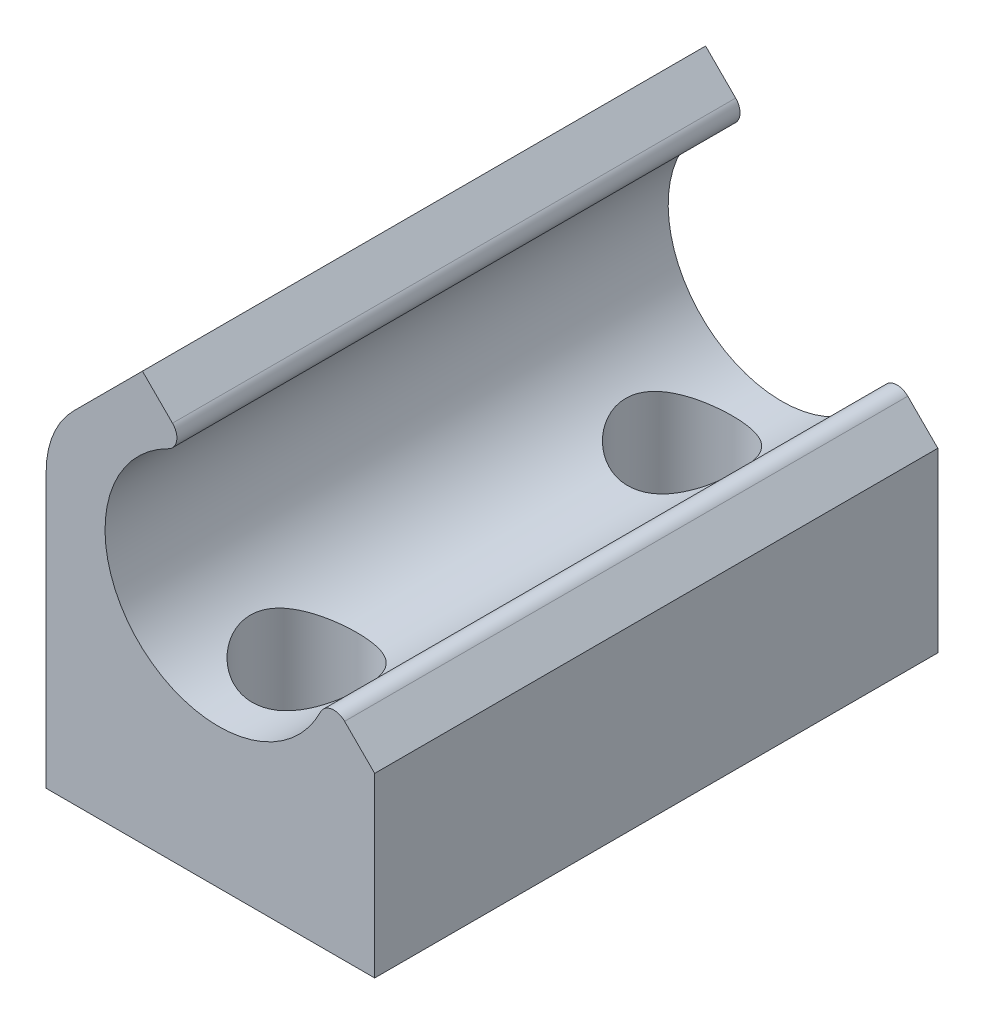
ISO-10303-21;
HEADER;
FILE_DESCRIPTION(('STEP AP214'),'2;1');
FILE_NAME('part.step','',(''),(''),'','','');
FILE_SCHEMA(('AUTOMOTIVE_DESIGN { 1 0 10303 214 1 1 1 1 }'));
ENDSEC;
DATA;
#1=APPLICATION_CONTEXT('core data for automotive mechanical design processes');
#2=APPLICATION_PROTOCOL_DEFINITION('international standard','automotive_design',2000,#1);
#3=PRODUCT_CONTEXT('',#1,'mechanical');
#4=PRODUCT('Part','Part','',(#3));
#5=PRODUCT_RELATED_PRODUCT_CATEGORY('part','',(#4));
#6=PRODUCT_DEFINITION_FORMATION('','',#4);
#7=PRODUCT_DEFINITION_CONTEXT('part definition',#1,'design');
#8=PRODUCT_DEFINITION('design','',#6,#7);
#9=PRODUCT_DEFINITION_SHAPE('','',#8);
#10=(LENGTH_UNIT() NAMED_UNIT(*) SI_UNIT(.MILLI.,.METRE.));
#11=(NAMED_UNIT(*) PLANE_ANGLE_UNIT() SI_UNIT($,.RADIAN.));
#12=(NAMED_UNIT(*) SI_UNIT($,.STERADIAN.) SOLID_ANGLE_UNIT());
#13=UNCERTAINTY_MEASURE_WITH_UNIT(LENGTH_MEASURE(1.E-05),#10,'distance_accuracy_value','');
#14=(GEOMETRIC_REPRESENTATION_CONTEXT(3) GLOBAL_UNCERTAINTY_ASSIGNED_CONTEXT((#13)) GLOBAL_UNIT_ASSIGNED_CONTEXT((#10,
#11,#12)) REPRESENTATION_CONTEXT('',''));
#15=CARTESIAN_POINT('',(0.,0.,0.));
#16=DIRECTION('',(0.,0.,1.));
#17=DIRECTION('',(1.,0.,0.));
#18=AXIS2_PLACEMENT_3D('',#15,#16,#17);
#19=CARTESIAN_POINT('',(9.1857781045255,13.4974390727315,30.));
#20=DIRECTION('',(0.,0.,-1.));
#21=DIRECTION('',(-1.,0.,0.));
#22=AXIS2_PLACEMENT_3D('',#19,#20,#21);
#23=CYLINDRICAL_SURFACE('',#22,6.05);
#24=CARTESIAN_POINT('',(9.1857781045255,13.4974390727315,30.));
#25=DIRECTION('',(0.,0.,-1.));
#26=DIRECTION('',(-1.,0.,0.));
#27=AXIS2_PLACEMENT_3D('',#24,#25,#26);
#28=CIRCLE('',#27,6.05);
#29=CARTESIAN_POINT('',(14.6152124653708,10.8284050674642,30.));
#30=VERTEX_POINT('',#29);
#31=CARTESIAN_POINT('',(6.51674409925826,18.9268734335767,30.));
#32=VERTEX_POINT('',#31);
#33=EDGE_CURVE('E210',#30,#32,#28,.T.);
#34=ORIENTED_EDGE('',*,*,#33,.F.);
#35=DIRECTION('',(0.,0.,-1.));
#36=VECTOR('',#35,1.);
#37=CARTESIAN_POINT('',(14.6152124653708,10.8284050674642,30.));
#38=LINE('',#37,#36);
#39=CARTESIAN_POINT('',(14.6152124653708,10.8284050674642,0.));
#40=VERTEX_POINT('',#39);
#41=EDGE_CURVE('E137',#30,#40,#38,.T.);
#42=ORIENTED_EDGE('',*,*,#41,.T.);
#43=CARTESIAN_POINT('',(9.1857781045255,13.4974390727315,0.));
#44=DIRECTION('',(0.,0.,-1.));
#45=DIRECTION('',(-1.,0.,0.));
#46=AXIS2_PLACEMENT_3D('',#43,#44,#45);
#47=CIRCLE('',#46,6.05);
#48=CARTESIAN_POINT('',(6.51674409925826,18.9268734335767,0.));
#49=VERTEX_POINT('',#48);
#50=EDGE_CURVE('E229',#40,#49,#47,.T.);
#51=ORIENTED_EDGE('',*,*,#50,.T.);
#52=DIRECTION('',(0.,0.,-1.));
#53=VECTOR('',#52,1.);
#54=CARTESIAN_POINT('',(6.51674409925826,18.9268734335767,30.));
#55=LINE('',#54,#53);
#56=EDGE_CURVE('E135',#49,#32,#55,.F.);
#57=ORIENTED_EDGE('',*,*,#56,.T.);
#58=EDGE_LOOP('',(#34,#42,#51,#57));
#59=FACE_BOUND('',#58,.T.);
#60=CARTESIAN_POINT('',(8.87549528494813,7.45540095866142,28.));
#61=CARTESIAN_POINT('',(9.03139950122602,7.44740435624747,27.9999884682132));
#62=CARTESIAN_POINT('',(9.18779808214235,7.44547694814391,27.9877768449764));
#63=CARTESIAN_POINT('',(9.49662535559507,7.45344673263323,27.939170372275));
#64=CARTESIAN_POINT('',(9.64904699591284,7.46336364166568,27.9027352443801));
#65=CARTESIAN_POINT('',(9.94496611693315,7.49342498274608,27.8071919153995));
#66=CARTESIAN_POINT('',(10.0884903727129,7.5135368716997,27.7481560034838));
#67=CARTESIAN_POINT('',(10.3636691682537,7.56156402023976,27.6094261179907));
#68=CARTESIAN_POINT('',(10.4953240499643,7.5894790549271,27.5297327397992));
#69=CARTESIAN_POINT('',(10.7502788587051,7.6516807365972,27.3475349797805));
#70=CARTESIAN_POINT('',(10.8728583994436,7.68621169164238,27.2441078185814));
#71=CARTESIAN_POINT('',(11.09984891244,7.75696914277472,27.019354128965));
#72=CARTESIAN_POINT('',(11.2042489267968,7.79319664489608,26.8980168859025));
#73=CARTESIAN_POINT('',(11.3998914951163,7.86610517699903,26.6300252938702));
#74=CARTESIAN_POINT('',(11.4895348563626,7.90261208430558,26.4821485884913));
#75=CARTESIAN_POINT('',(11.642570867745,7.96809560750674,26.1718295053516));
#76=CARTESIAN_POINT('',(11.705973996028,7.99707522744343,26.0093929731479));
#77=CARTESIAN_POINT('',(11.8021735069858,8.04219106759068,25.6803361510441));
#78=CARTESIAN_POINT('',(11.8359836555846,8.05874965271986,25.5140734029774));
#79=CARTESIAN_POINT('',(11.8750191615476,8.07793758194683,25.1774857684325));
#80=CARTESIAN_POINT('',(11.8802668062833,8.08057778653051,25.0071641533644));
#81=CARTESIAN_POINT('',(11.8628181806249,8.07194410347054,24.6845307256137));
#82=CARTESIAN_POINT('',(11.8427096597932,8.06195848980425,24.5320348069978));
#83=CARTESIAN_POINT('',(11.7797850452715,8.03165161456526,24.2328784775741));
#84=CARTESIAN_POINT('',(11.7369634520435,8.01132784985495,24.0862194893175));
#85=CARTESIAN_POINT('',(11.6294066801047,7.96257784291409,23.8001301326586));
#86=CARTESIAN_POINT('',(11.5643565085781,7.93403611706231,23.6608389008156));
#87=CARTESIAN_POINT('',(11.4143686578002,7.87227669636158,23.3945404094432));
#88=CARTESIAN_POINT('',(11.3294224796463,7.83905700566894,23.2675384323227));
#89=CARTESIAN_POINT('',(11.1321835410953,7.76803884667235,23.0162369263696));
#90=CARTESIAN_POINT('',(11.0180211402644,7.73011170622754,22.8934362407789));
#91=CARTESIAN_POINT('',(10.7703027638599,7.65719569775622,22.6681023647629));
#92=CARTESIAN_POINT('',(10.6367412657133,7.62220767093421,22.5655749654693));
#93=CARTESIAN_POINT('',(10.3495689921729,7.5585656625862,22.3814335797287));
#94=CARTESIAN_POINT('',(10.1955448033763,7.53008928656067,22.3003980892383));
#95=CARTESIAN_POINT('',(9.87436477748037,7.48457200110711,22.1658315230099));
#96=CARTESIAN_POINT('',(9.70721906756909,7.46752236759392,22.1122794715607));
#97=CARTESIAN_POINT('',(9.37916590008335,7.44848132739527,22.0381974626905));
#98=CARTESIAN_POINT('',(9.21884562249271,7.44538452891219,22.0153489461199));
#99=CARTESIAN_POINT('',(8.89691648037471,7.4521976626231,21.9957495066285));
#100=CARTESIAN_POINT('',(8.73530804581879,7.46210342170024,21.9989902121935));
#101=CARTESIAN_POINT('',(8.42541232444363,7.49350730342819,22.03010813462));
#102=CARTESIAN_POINT('',(8.27690059816906,7.51428933887077,22.056525112841));
#103=CARTESIAN_POINT('',(7.98707655238687,7.56555164683524,22.1306622206776));
#104=CARTESIAN_POINT('',(7.84576543698287,7.59603353525584,22.1783859003115));
#105=CARTESIAN_POINT('',(7.56697382975105,7.66617884046378,22.2959802836046));
#106=CARTESIAN_POINT('',(7.4299778408795,7.70620359865458,22.3667784978471));
#107=CARTESIAN_POINT('',(7.16956518845382,7.79163507559248,22.5275013347356));
#108=CARTESIAN_POINT('',(7.04615506229742,7.83704436368767,22.6174351047282));
#109=CARTESIAN_POINT('',(6.80229039905101,7.93501560243132,22.82510855536));
#110=CARTESIAN_POINT('',(6.68359123576775,7.98782068093556,22.9448013555173));
#111=CARTESIAN_POINT('',(6.46736656834592,8.0912271099332,23.2029657019698));
#112=CARTESIAN_POINT('',(6.3698587683695,8.14182658978098,23.3414527941189));
#113=CARTESIAN_POINT('',(6.19494795202944,8.23741776699545,23.6413398023546));
#114=CARTESIAN_POINT('',(6.11857926206208,8.2820784294398,23.8034648394267));
#115=CARTESIAN_POINT('',(6.02617872039569,8.33791204694233,24.0568649344285));
#116=CARTESIAN_POINT('',(5.99907408067541,8.35466128009002,24.1430140441605));
#117=CARTESIAN_POINT('',(5.95261318254559,8.38374170477446,24.3181288589389));
#118=CARTESIAN_POINT('',(5.93325523714561,8.39607385815311,24.4070939461937));
#119=CARTESIAN_POINT('',(5.90457256610746,8.41448306829454,24.5757365720437));
#120=CARTESIAN_POINT('',(5.89429824134949,8.42114804847093,24.6551901540139));
#121=CARTESIAN_POINT('',(5.88013863406065,8.43035706295575,24.814898591548));
#122=CARTESIAN_POINT('',(5.87625250893076,8.43290164074169,24.8951533400336));
#123=CARTESIAN_POINT('',(5.87493923433004,8.43375976439538,25.0557137543537));
#124=CARTESIAN_POINT('',(5.87750981964802,8.43207479411788,25.1360193924523));
#125=CARTESIAN_POINT('',(5.88905071700072,8.42455734069397,25.2959495605022));
#126=CARTESIAN_POINT('',(5.89802074755596,8.41872503996785,25.3755741202548));
#127=CARTESIAN_POINT('',(5.9315876511128,8.39710218152119,25.5944743643302));
#128=CARTESIAN_POINT('',(5.96290174999751,8.37710018389469,25.7323706845501));
#129=CARTESIAN_POINT('',(6.0438194705235,8.32706003019277,26.000652593341));
#130=CARTESIAN_POINT('',(6.0934292178601,8.29701851303134,26.1310356494178));
#131=CARTESIAN_POINT('',(6.2140911613304,8.22706700270819,26.3926050806416));
#132=CARTESIAN_POINT('',(6.28657939839812,8.18654559224072,26.5229629488515));
#133=CARTESIAN_POINT('',(6.44915917513535,8.10097248772729,26.7705530207602));
#134=CARTESIAN_POINT('',(6.53926060567717,8.05591825515935,26.8877777909743));
#135=CARTESIAN_POINT('',(6.75022416905689,7.95793928049711,27.1241368962574));
#136=CARTESIAN_POINT('',(6.87367521154988,7.90485089846459,27.2409012101503));
#137=CARTESIAN_POINT('',(7.1396155368062,7.80217882073999,27.452668857923));
#138=CARTESIAN_POINT('',(7.2821189939908,7.75259777680563,27.5476558458985));
#139=CARTESIAN_POINT('',(7.5099657180754,7.68359872877431,27.6726669562825));
#140=CARTESIAN_POINT('',(7.58950715245339,7.66121526915527,27.7118533633208));
#141=CARTESIAN_POINT('',(7.75232825978302,7.61910817244812,27.7832327540107));
#142=CARTESIAN_POINT('',(7.83560609394893,7.59938324575074,27.8154291330698));
#143=CARTESIAN_POINT('',(8.00512817653033,7.56312656790203,27.8723578620836));
#144=CARTESIAN_POINT('',(8.09136521832527,7.54658762931149,27.8971070851428));
#145=CARTESIAN_POINT('',(8.26624523273616,7.51707002149457,27.9388582892593));
#146=CARTESIAN_POINT('',(8.35488665526586,7.50408911569059,27.9558651416315));
#147=CARTESIAN_POINT('',(8.51546118610677,7.48426102242456,27.9791843209241));
#148=CARTESIAN_POINT('',(8.58709447263674,7.47670195062563,27.9869742880269));
#149=CARTESIAN_POINT('',(8.73094810635742,7.4641267078896,27.9973849958789));
#150=CARTESIAN_POINT('',(8.80316849707305,7.45911072726373,28.0000053498046));
#151=CARTESIAN_POINT('',(8.87549528494813,7.45540095866142,28.));
#152=B_SPLINE_CURVE_WITH_KNOTS('',3,(#60,#61,#62,#63,#64,#65,#66,#67,#68,#69,#70,#71,#72,#73,
#74,#75,#76,#77,#78,#79,#80,#81,#82,#83,#84,#85,#86,#87,#88,#89,#90,#91,#92,#93,#94,#95,#96,#97,
#98,#99,#100,#101,#102,#103,#104,#105,#106,#107,#108,#109,#110,#111,#112,#113,#114,#115,#116,
#117,#118,#119,#120,#121,#122,#123,#124,#125,#126,#127,#128,#129,#130,#131,#132,#133,#134,#135,
#136,#137,#138,#139,#140,#141,#142,#143,#144,#145,#146,#147,#148,#149,#150,#151),.UNSPECIFIED.,
.T.,.F.,(4,2,2,2,2,2,2,2,2,2,2,2,2,2,2,2,2,2,2,2,2,2,2,2,2,2,2,2,2,2,2,2,2,2,2,2,2,2,2,2,2,2,2,
2,2,4),(0.,0.468051519431484,0.936883259942432,1.40422779275271,1.87155885733728,
2.36167663777968,2.85208882689792,3.37970829950646,3.90711688141939,4.41565830874937,
4.92380286337144,5.38404252648297,5.84439367877282,6.31155917403817,6.77892459176479,
7.29233304118356,7.80588793624415,8.33211545302117,8.85794074673161,9.34127944264786,
9.82446305093993,10.2792275979235,10.7340679438385,11.2100805728486,11.6863212628887,
12.2139430832411,12.7420040210141,13.2925772538213,13.5677452144805,13.8428532194166,
14.0836830237557,14.3244810602639,14.5651946292688,14.805897611145,15.2323284284895,
15.6589021519645,16.1208194904601,16.5829969725004,17.1147631823857,17.6469272348777,
17.9209644880393,18.1948683282359,18.4681468258848,18.7412531447837,18.9583744708216,
19.1755120426509),.UNSPECIFIED.);
#153=CARTESIAN_POINT('',(8.87549528494813,7.45540095866142,28.));
#154=VERTEX_POINT('',#153);
#155=EDGE_CURVE('E159',#154,#154,#152,.T.);
#156=ORIENTED_EDGE('',*,*,#155,.F.);
#157=EDGE_LOOP('',(#156));
#158=FACE_BOUND('',#157,.T.);
#159=CARTESIAN_POINT('',(8.87549528494813,7.45540095866142,8.));
#160=CARTESIAN_POINT('',(9.03139950122602,7.44740435624747,7.99998846821321));
#161=CARTESIAN_POINT('',(9.18779808214235,7.44547694814391,7.98777684497635));
#162=CARTESIAN_POINT('',(9.49662535559507,7.45344673263323,7.93917037227496));
#163=CARTESIAN_POINT('',(9.64904699591284,7.46336364166568,7.9027352443801));
#164=CARTESIAN_POINT('',(9.94496611693315,7.49342498274608,7.80719191539948));
#165=CARTESIAN_POINT('',(10.0884903727129,7.5135368716997,7.74815600348381));
#166=CARTESIAN_POINT('',(10.3636691682537,7.56156402023976,7.6094261179907));
#167=CARTESIAN_POINT('',(10.4953240499643,7.5894790549271,7.52973273979915));
#168=CARTESIAN_POINT('',(10.7502788587051,7.6516807365972,7.34753497978051));
#169=CARTESIAN_POINT('',(10.8728583994436,7.68621169164238,7.24410781858141));
#170=CARTESIAN_POINT('',(11.09984891244,7.75696914277472,7.01935412896496));
#171=CARTESIAN_POINT('',(11.2042489267968,7.79319664489608,6.89801688590247));
#172=CARTESIAN_POINT('',(11.3998914951163,7.86610517699903,6.63002529387015));
#173=CARTESIAN_POINT('',(11.4895348563626,7.90261208430558,6.48214858849132));
#174=CARTESIAN_POINT('',(11.642570867745,7.96809560750674,6.17182950535158));
#175=CARTESIAN_POINT('',(11.705973996028,7.99707522744343,6.00939297314791));
#176=CARTESIAN_POINT('',(11.8021735069858,8.04219106759068,5.68033615104408));
#177=CARTESIAN_POINT('',(11.8359836555846,8.05874965271986,5.51407340297739));
#178=CARTESIAN_POINT('',(11.8750191615476,8.07793758194683,5.17748576843248));
#179=CARTESIAN_POINT('',(11.8802668062833,8.08057778653051,5.0071641533644));
#180=CARTESIAN_POINT('',(11.8628181806249,8.07194410347054,4.68453072561368));
#181=CARTESIAN_POINT('',(11.8427096597932,8.06195848980425,4.53203480699778));
#182=CARTESIAN_POINT('',(11.7797850452715,8.03165161456526,4.23287847757408));
#183=CARTESIAN_POINT('',(11.7369634520435,8.01132784985495,4.08621948931746));
#184=CARTESIAN_POINT('',(11.6294066801047,7.96257784291409,3.80013013265858));
#185=CARTESIAN_POINT('',(11.5643565085781,7.93403611706231,3.66083890081561));
#186=CARTESIAN_POINT('',(11.4143686578002,7.87227669636158,3.39454040944315));
#187=CARTESIAN_POINT('',(11.3294224796463,7.83905700566894,3.2675384323227));
#188=CARTESIAN_POINT('',(11.1321835410953,7.76803884667235,3.01623692636957));
#189=CARTESIAN_POINT('',(11.0180211402644,7.73011170622754,2.89343624077893));
#190=CARTESIAN_POINT('',(10.7703027638599,7.65719569775622,2.66810236476289));
#191=CARTESIAN_POINT('',(10.6367412657133,7.62220767093421,2.56557496546933));
#192=CARTESIAN_POINT('',(10.3495689921729,7.5585656625862,2.38143357972874));
#193=CARTESIAN_POINT('',(10.1955448033763,7.53008928656067,2.30039808923825));
#194=CARTESIAN_POINT('',(9.87436477748037,7.48457200110711,2.16583152300988));
#195=CARTESIAN_POINT('',(9.70721906756909,7.46752236759392,2.11227947156065));
#196=CARTESIAN_POINT('',(9.37916590008335,7.44848132739527,2.03819746269052));
#197=CARTESIAN_POINT('',(9.21884562249271,7.44538452891219,2.01534894611987));
#198=CARTESIAN_POINT('',(8.89691648037471,7.4521976626231,1.99574950662849));
#199=CARTESIAN_POINT('',(8.73530804581879,7.46210342170023,1.99899021219348));
#200=CARTESIAN_POINT('',(8.42541232444364,7.49350730342818,2.03010813462003));
#201=CARTESIAN_POINT('',(8.27690059816906,7.51428933887077,2.05652511284095));
#202=CARTESIAN_POINT('',(7.98707655238687,7.56555164683524,2.13066222067764));
#203=CARTESIAN_POINT('',(7.84576543698287,7.59603353525584,2.17838590031147));
#204=CARTESIAN_POINT('',(7.56697382975105,7.66617884046378,2.29598028360457));
#205=CARTESIAN_POINT('',(7.4299778408795,7.70620359865458,2.36677849784712));
#206=CARTESIAN_POINT('',(7.16956518845382,7.79163507559248,2.52750133473555));
#207=CARTESIAN_POINT('',(7.04615506229742,7.83704436368767,2.6174351047282));
#208=CARTESIAN_POINT('',(6.80229039905102,7.93501560243132,2.82510855536));
#209=CARTESIAN_POINT('',(6.68359123576775,7.98782068093556,2.94480135551732));
#210=CARTESIAN_POINT('',(6.46736656834592,8.0912271099332,3.20296570196979));
#211=CARTESIAN_POINT('',(6.3698587683695,8.14182658978098,3.34145279411889));
#212=CARTESIAN_POINT('',(6.19494795202944,8.23741776699545,3.64133980235455));
#213=CARTESIAN_POINT('',(6.11857926206208,8.2820784294398,3.8034648394267));
#214=CARTESIAN_POINT('',(6.02617872039569,8.33791204694233,4.05686493442845));
#215=CARTESIAN_POINT('',(5.99907408067541,8.35466128009002,4.14301404416052));
#216=CARTESIAN_POINT('',(5.95261318254559,8.38374170477446,4.31812885893887));
#217=CARTESIAN_POINT('',(5.93325523714561,8.39607385815311,4.40709394619365));
#218=CARTESIAN_POINT('',(5.90457256610746,8.41448306829454,4.57573657204369));
#219=CARTESIAN_POINT('',(5.89429824134949,8.42114804847093,4.65519015401389));
#220=CARTESIAN_POINT('',(5.88013863406065,8.43035706295575,4.81489859154803));
#221=CARTESIAN_POINT('',(5.87625250893076,8.43290164074169,4.89515334003357));
#222=CARTESIAN_POINT('',(5.87493923433004,8.43375976439538,5.05571375435374));
#223=CARTESIAN_POINT('',(5.87750981964802,8.43207479411788,5.13601939245235));
#224=CARTESIAN_POINT('',(5.88905071700072,8.42455734069397,5.29594956050222));
#225=CARTESIAN_POINT('',(5.89802074755596,8.41872503996785,5.37557412025482));
#226=CARTESIAN_POINT('',(5.9315876511128,8.39710218152119,5.59447436433021));
#227=CARTESIAN_POINT('',(5.96290174999751,8.37710018389469,5.73237068455012));
#228=CARTESIAN_POINT('',(6.0438194705235,8.32706003019277,6.00065259334102));
#229=CARTESIAN_POINT('',(6.0934292178601,8.29701851303134,6.1310356494178));
#230=CARTESIAN_POINT('',(6.2140911613304,8.22706700270819,6.3926050806416));
#231=CARTESIAN_POINT('',(6.28657939839812,8.18654559224072,6.52296294885153));
#232=CARTESIAN_POINT('',(6.44915917513535,8.10097248772729,6.77055302076015));
#233=CARTESIAN_POINT('',(6.53926060567717,8.05591825515935,6.88777779097431));
#234=CARTESIAN_POINT('',(6.75022416905689,7.95793928049711,7.12413689625742));
#235=CARTESIAN_POINT('',(6.87367521154988,7.90485089846459,7.24090121015031));
#236=CARTESIAN_POINT('',(7.1396155368062,7.80217882073999,7.45266885792299));
#237=CARTESIAN_POINT('',(7.2821189939908,7.75259777680563,7.54765584589848));
#238=CARTESIAN_POINT('',(7.5099657180754,7.68359872877431,7.6726669562825));
#239=CARTESIAN_POINT('',(7.58950715245339,7.66121526915527,7.7118533633208));
#240=CARTESIAN_POINT('',(7.75232825978303,7.61910817244812,7.78323275401069));
#241=CARTESIAN_POINT('',(7.83560609394893,7.59938324575074,7.8154291330698));
#242=CARTESIAN_POINT('',(8.00512817653033,7.56312656790203,7.87235786208361));
#243=CARTESIAN_POINT('',(8.09136521832527,7.54658762931149,7.89710708514279));
#244=CARTESIAN_POINT('',(8.26624523273616,7.51707002149457,7.93885828925927));
#245=CARTESIAN_POINT('',(8.35488665526586,7.50408911569059,7.95586514163149));
#246=CARTESIAN_POINT('',(8.51546118610677,7.48426102242456,7.97918432092406));
#247=CARTESIAN_POINT('',(8.58709447263674,7.47670195062563,7.98697428802689));
#248=CARTESIAN_POINT('',(8.73094810635742,7.4641267078896,7.99738499587894));
#249=CARTESIAN_POINT('',(8.80316849707305,7.45911072726373,8.00000534980462));
#250=CARTESIAN_POINT('',(8.87549528494813,7.45540095866142,8.));
#251=B_SPLINE_CURVE_WITH_KNOTS('',3,(#159,#160,#161,#162,#163,#164,#165,#166,#167,#168,#169,
#170,#171,#172,#173,#174,#175,#176,#177,#178,#179,#180,#181,#182,#183,#184,#185,#186,#187,#188,
#189,#190,#191,#192,#193,#194,#195,#196,#197,#198,#199,#200,#201,#202,#203,#204,#205,#206,#207,
#208,#209,#210,#211,#212,#213,#214,#215,#216,#217,#218,#219,#220,#221,#222,#223,#224,#225,#226,
#227,#228,#229,#230,#231,#232,#233,#234,#235,#236,#237,#238,#239,#240,#241,#242,#243,#244,#245,
#246,#247,#248,#249,#250),.UNSPECIFIED.,.T.,.F.,(4,2,2,2,2,2,2,2,2,2,2,2,2,2,2,2,2,2,2,2,2,2,2,
2,2,2,2,2,2,2,2,2,2,2,2,2,2,2,2,2,2,2,2,2,2,4),(0.,0.468051519431484,0.936883259942432,
1.40422779275271,1.87155885733728,2.36167663777967,2.85208882689792,3.37970829950646,
3.90711688141939,4.41565830874937,4.92380286337144,5.38404252648297,5.84439367877282,
6.31155917403817,6.77892459176479,7.29233304118356,7.80588793624415,8.33211545302118,
8.85794074673161,9.34127944264786,9.82446305093993,10.2792275979235,10.7340679438385,
11.2100805728486,11.6863212628887,12.2139430832411,12.7420040210141,13.2925772538213,
13.5677452144805,13.8428532194166,14.0836830237557,14.3244810602639,14.5651946292688,
14.805897611145,15.2323284284895,15.6589021519645,16.1208194904601,16.5829969725004,
17.1147631823857,17.6469272348777,17.9209644880393,18.1948683282359,18.4681468258848,
18.7412531447837,18.9583744708216,19.1755120426509),.UNSPECIFIED.);
#252=CARTESIAN_POINT('',(8.87549528494813,7.45540095866142,8.));
#253=VERTEX_POINT('',#252);
#254=EDGE_CURVE('E166',#253,#253,#251,.T.);
#255=ORIENTED_EDGE('',*,*,#254,.F.);
#256=EDGE_LOOP('',(#255));
#257=FACE_BOUND('',#256,.T.);
#258=ADVANCED_FACE('F35',(#59,#158,#257),#23,.F.);
#259=CARTESIAN_POINT('',(0.,16.6833219364119,30.));
#260=DIRECTION('',(1.,0.,0.));
#261=DIRECTION('',(0.,1.,0.));
#262=AXIS2_PLACEMENT_3D('',#259,#260,#261);
#263=PLANE('',#262);
#264=DIRECTION('',(0.,-1.,0.));
#265=VECTOR('',#264,1.);
#266=CARTESIAN_POINT('',(0.,16.6833219364119,30.));
#267=LINE('',#266,#265);
#268=CARTESIAN_POINT('',(0.,14.6122541245465,30.));
#269=VERTEX_POINT('',#268);
#270=CARTESIAN_POINT('',(0.,0.,30.));
#271=VERTEX_POINT('',#270);
#272=EDGE_CURVE('E111',#269,#271,#267,.T.);
#273=ORIENTED_EDGE('',*,*,#272,.F.);
#274=DIRECTION('',(0.,0.,-1.));
#275=VECTOR('',#274,1.);
#276=CARTESIAN_POINT('',(0.,14.6122541245465,30.));
#277=LINE('',#276,#275);
#278=CARTESIAN_POINT('',(0.,14.6122541245465,0.));
#279=VERTEX_POINT('',#278);
#280=EDGE_CURVE('E158',#269,#279,#277,.T.);
#281=ORIENTED_EDGE('',*,*,#280,.T.);
#282=DIRECTION('',(0.,-1.,0.));
#283=VECTOR('',#282,1.);
#284=CARTESIAN_POINT('',(0.,16.6833219364119,0.));
#285=LINE('',#284,#283);
#286=CARTESIAN_POINT('',(0.,0.,0.));
#287=VERTEX_POINT('',#286);
#288=EDGE_CURVE('E133',#279,#287,#285,.T.);
#289=ORIENTED_EDGE('',*,*,#288,.T.);
#290=DIRECTION('',(0.,0.,-1.));
#291=VECTOR('',#290,1.);
#292=CARTESIAN_POINT('',(0.,0.,30.));
#293=LINE('',#292,#291);
#294=EDGE_CURVE('E126',#271,#287,#293,.T.);
#295=ORIENTED_EDGE('',*,*,#294,.F.);
#296=EDGE_LOOP('',(#273,#281,#289,#295));
#297=FACE_BOUND('',#296,.T.);
#298=ADVANCED_FACE('F132',(#297),#263,.F.);
#299=CARTESIAN_POINT('',(0.,0.,30.));
#300=DIRECTION('',(0.,1.,0.));
#301=DIRECTION('',(0.,0.,1.));
#302=AXIS2_PLACEMENT_3D('',#299,#300,#301);
#303=PLANE('',#302);
#304=CARTESIAN_POINT('',(8.87549528494813,0.,5.));
#305=DIRECTION('',(0.,-1.,0.));
#306=DIRECTION('',(0.,0.,-1.));
#307=AXIS2_PLACEMENT_3D('',#304,#305,#306);
#308=CIRCLE('',#307,1.55);
#309=CARTESIAN_POINT('',(8.87549528494813,0.,3.45));
#310=VERTEX_POINT('',#309);
#311=EDGE_CURVE('E269',#310,#310,#308,.T.);
#312=ORIENTED_EDGE('',*,*,#311,.F.);
#313=EDGE_LOOP('',(#312));
#314=FACE_BOUND('',#313,.T.);
#315=CARTESIAN_POINT('',(8.87549528494813,0.,25.));
#316=DIRECTION('',(0.,-1.,0.));
#317=DIRECTION('',(0.,0.,-1.));
#318=AXIS2_PLACEMENT_3D('',#315,#316,#317);
#319=CIRCLE('',#318,1.55);
#320=CARTESIAN_POINT('',(8.87549528494813,0.,23.45));
#321=VERTEX_POINT('',#320);
#322=EDGE_CURVE('E266',#321,#321,#319,.T.);
#323=ORIENTED_EDGE('',*,*,#322,.F.);
#324=EDGE_LOOP('',(#323));
#325=FACE_BOUND('',#324,.T.);
#326=DIRECTION('',(1.,0.,0.));
#327=VECTOR('',#326,1.);
#328=CARTESIAN_POINT('',(0.,0.,0.));
#329=LINE('',#328,#327);
#330=CARTESIAN_POINT('',(17.5,0.,0.));
#331=VERTEX_POINT('',#330);
#332=EDGE_CURVE('E217',#287,#331,#329,.T.);
#333=ORIENTED_EDGE('',*,*,#332,.T.);
#334=DIRECTION('',(0.,0.,-1.));
#335=VECTOR('',#334,1.);
#336=CARTESIAN_POINT('',(17.5,0.,30.));
#337=LINE('',#336,#335);
#338=CARTESIAN_POINT('',(17.5,0.,30.));
#339=VERTEX_POINT('',#338);
#340=EDGE_CURVE('E128',#339,#331,#337,.T.);
#341=ORIENTED_EDGE('',*,*,#340,.F.);
#342=DIRECTION('',(1.,0.,0.));
#343=VECTOR('',#342,1.);
#344=CARTESIAN_POINT('',(0.,0.,30.));
#345=LINE('',#344,#343);
#346=EDGE_CURVE('E114',#271,#339,#345,.T.);
#347=ORIENTED_EDGE('',*,*,#346,.F.);
#348=ORIENTED_EDGE('',*,*,#294,.T.);
#349=EDGE_LOOP('',(#333,#341,#347,#348));
#350=FACE_BOUND('',#349,.T.);
#351=ADVANCED_FACE('F125',(#314,#325,#350),#303,.F.);
#352=CARTESIAN_POINT('',(17.5,0.,30.));
#353=DIRECTION('',(-1.,0.,0.));
#354=DIRECTION('',(0.,0.,1.));
#355=AXIS2_PLACEMENT_3D('',#352,#353,#354);
#356=PLANE('',#355);
#357=DIRECTION('',(0.,1.,0.));
#358=VECTOR('',#357,1.);
#359=CARTESIAN_POINT('',(17.5,0.,0.));
#360=LINE('',#359,#358);
#361=CARTESIAN_POINT('',(17.5,9.44,0.));
#362=VERTEX_POINT('',#361);
#363=EDGE_CURVE('E219',#331,#362,#360,.T.);
#364=ORIENTED_EDGE('',*,*,#363,.T.);
#365=DIRECTION('',(0.,0.,-1.));
#366=VECTOR('',#365,1.);
#367=CARTESIAN_POINT('',(17.5,9.44,30.));
#368=LINE('',#367,#366);
#369=CARTESIAN_POINT('',(17.5,9.44,30.));
#370=VERTEX_POINT('',#369);
#371=EDGE_CURVE('E139',#370,#362,#368,.T.);
#372=ORIENTED_EDGE('',*,*,#371,.F.);
#373=DIRECTION('',(0.,1.,0.));
#374=VECTOR('',#373,1.);
#375=CARTESIAN_POINT('',(17.5,0.,30.));
#376=LINE('',#375,#374);
#377=EDGE_CURVE('E130',#339,#370,#376,.T.);
#378=ORIENTED_EDGE('',*,*,#377,.F.);
#379=ORIENTED_EDGE('',*,*,#340,.T.);
#380=EDGE_LOOP('',(#364,#372,#378,#379));
#381=FACE_BOUND('',#380,.T.);
#382=ADVANCED_FACE('F198',(#381),#356,.F.);
#383=CARTESIAN_POINT('',(17.5,9.44,30.));
#384=DIRECTION('',(-0.707106781186547,-0.707106781186548,0.));
#385=DIRECTION('',(0.707106781186548,-0.707106781186547,0.));
#386=AXIS2_PLACEMENT_3D('',#383,#384,#385);
#387=PLANE('',#386);
#388=DIRECTION('',(-0.707106781186548,0.707106781186547,0.));
#389=VECTOR('',#388,1.);
#390=CARTESIAN_POINT('',(17.5,9.44,0.));
#391=LINE('',#390,#389);
#392=CARTESIAN_POINT('',(15.8988396239855,11.0411603760145,0.));
#393=VERTEX_POINT('',#392);
#394=EDGE_CURVE('E226',#362,#393,#391,.T.);
#395=ORIENTED_EDGE('',*,*,#394,.T.);
#396=DIRECTION('',(0.,0.,-1.));
#397=VECTOR('',#396,1.);
#398=CARTESIAN_POINT('',(15.8988396239855,11.0411603760145,30.));
#399=LINE('',#398,#397);
#400=CARTESIAN_POINT('',(15.8988396239855,11.0411603760145,30.));
#401=VERTEX_POINT('',#400);
#402=EDGE_CURVE('E149',#393,#401,#399,.F.);
#403=ORIENTED_EDGE('',*,*,#402,.T.);
#404=DIRECTION('',(-0.707106781186548,0.707106781186547,0.));
#405=VECTOR('',#404,1.);
#406=CARTESIAN_POINT('',(17.5,9.44,30.));
#407=LINE('',#406,#405);
#408=EDGE_CURVE('E243',#370,#401,#407,.T.);
#409=ORIENTED_EDGE('',*,*,#408,.F.);
#410=ORIENTED_EDGE('',*,*,#371,.T.);
#411=EDGE_LOOP('',(#395,#403,#409,#410));
#412=FACE_BOUND('',#411,.T.);
#413=ADVANCED_FACE('F193',(#412),#387,.F.);
#414=CARTESIAN_POINT('',(7.60321276594693,19.336787234053,30.));
#415=DIRECTION('',(-0.707106781186546,-0.707106781186549,0.));
#416=DIRECTION('',(0.707106781186549,-0.707106781186546,0.));
#417=AXIS2_PLACEMENT_3D('',#414,#415,#416);
#418=PLANE('',#417);
#419=DIRECTION('',(-0.707106781186548,0.707106781186546,0.));
#420=VECTOR('',#419,1.);
#421=CARTESIAN_POINT('',(7.60321276594693,19.336787234053,30.));
#422=LINE('',#421,#420);
#423=CARTESIAN_POINT('',(6.72949940780852,20.2105005921914,30.));
#424=VERTEX_POINT('',#423);
#425=CARTESIAN_POINT('',(5.12833903179401,21.811660968206,30.));
#426=VERTEX_POINT('',#425);
#427=EDGE_CURVE('E253',#424,#426,#422,.T.);
#428=ORIENTED_EDGE('',*,*,#427,.F.);
#429=DIRECTION('',(0.,0.,-1.));
#430=VECTOR('',#429,1.);
#431=CARTESIAN_POINT('',(6.72949940780852,20.2105005921914,30.));
#432=LINE('',#431,#430);
#433=CARTESIAN_POINT('',(6.72949940780852,20.2105005921914,0.));
#434=VERTEX_POINT('',#433);
#435=EDGE_CURVE('E155',#424,#434,#432,.T.);
#436=ORIENTED_EDGE('',*,*,#435,.T.);
#437=DIRECTION('',(-0.707106781186548,0.707106781186546,0.));
#438=VECTOR('',#437,1.);
#439=CARTESIAN_POINT('',(7.60321276594693,19.336787234053,0.));
#440=LINE('',#439,#438);
#441=CARTESIAN_POINT('',(5.12833903179401,21.811660968206,0.));
#442=VERTEX_POINT('',#441);
#443=EDGE_CURVE('E232',#434,#442,#440,.T.);
#444=ORIENTED_EDGE('',*,*,#443,.T.);
#445=DIRECTION('',(0.,0.,-1.));
#446=VECTOR('',#445,1.);
#447=CARTESIAN_POINT('',(5.12833903179401,21.811660968206,30.));
#448=LINE('',#447,#446);
#449=EDGE_CURVE('E235',#426,#442,#448,.T.);
#450=ORIENTED_EDGE('',*,*,#449,.F.);
#451=EDGE_LOOP('',(#428,#436,#444,#450));
#452=FACE_BOUND('',#451,.T.);
#453=ADVANCED_FACE('F191',(#452),#418,.F.);
#454=CARTESIAN_POINT('',(5.12833903179401,21.811660968206,30.));
#455=DIRECTION('',(0.707106781186549,-0.707106781186546,0.));
#456=DIRECTION('',(0.707106781186546,0.707106781186549,0.));
#457=AXIS2_PLACEMENT_3D('',#454,#455,#456);
#458=PLANE('',#457);
#459=DIRECTION('',(-0.707106781186546,-0.707106781186549,0.));
#460=VECTOR('',#459,1.);
#461=CARTESIAN_POINT('',(5.12833903179401,21.811660968206,0.));
#462=LINE('',#461,#460);
#463=CARTESIAN_POINT('',(1.46446609406726,18.1477880304792,0.));
#464=VERTEX_POINT('',#463);
#465=EDGE_CURVE('E121',#442,#464,#462,.T.);
#466=ORIENTED_EDGE('',*,*,#465,.T.);
#467=DIRECTION('',(0.,0.,-1.));
#468=VECTOR('',#467,1.);
#469=CARTESIAN_POINT('',(1.46446609406726,18.1477880304792,30.));
#470=LINE('',#469,#468);
#471=CARTESIAN_POINT('',(1.46446609406726,18.1477880304792,30.));
#472=VERTEX_POINT('',#471);
#473=EDGE_CURVE('E43',#464,#472,#470,.F.);
#474=ORIENTED_EDGE('',*,*,#473,.T.);
#475=DIRECTION('',(-0.707106781186546,-0.707106781186549,0.));
#476=VECTOR('',#475,1.);
#477=CARTESIAN_POINT('',(5.12833903179401,21.811660968206,30.));
#478=LINE('',#477,#476);
#479=EDGE_CURVE('E222',#426,#472,#478,.T.);
#480=ORIENTED_EDGE('',*,*,#479,.F.);
#481=ORIENTED_EDGE('',*,*,#449,.T.);
#482=EDGE_LOOP('',(#466,#474,#480,#481));
#483=FACE_BOUND('',#482,.T.);
#484=ADVANCED_FACE('F186',(#483),#458,.F.);
#485=CARTESIAN_POINT('',(9.1857781045255,13.4974390727315,30.));
#486=DIRECTION('',(0.,0.,-1.));
#487=DIRECTION('',(-1.,0.,0.));
#488=AXIS2_PLACEMENT_3D('',#485,#486,#487);
#489=PLANE('',#488);
#490=ORIENTED_EDGE('',*,*,#479,.T.);
#491=CARTESIAN_POINT('',(5.,14.6122541245465,30.));
#492=DIRECTION('',(0.,0.,-1.));
#493=DIRECTION('',(-1.,0.,0.));
#494=AXIS2_PLACEMENT_3D('',#491,#492,#493);
#495=CIRCLE('',#494,5.);
#496=EDGE_CURVE('E11',#472,#269,#495,.F.);
#497=ORIENTED_EDGE('',*,*,#496,.T.);
#498=ORIENTED_EDGE('',*,*,#272,.T.);
#499=ORIENTED_EDGE('',*,*,#346,.T.);
#500=ORIENTED_EDGE('',*,*,#377,.T.);
#501=ORIENTED_EDGE('',*,*,#408,.T.);
#502=CARTESIAN_POINT('',(15.3331541990363,10.4754749510653,30.));
#503=DIRECTION('',(0.,0.,-1.));
#504=DIRECTION('',(-1.,0.,0.));
#505=AXIS2_PLACEMENT_3D('',#502,#503,#504);
#506=CIRCLE('',#505,0.8);
#507=EDGE_CURVE('E153',#401,#30,#506,.F.);
#508=ORIENTED_EDGE('',*,*,#507,.T.);
#509=ORIENTED_EDGE('',*,*,#33,.T.);
#510=CARTESIAN_POINT('',(6.16381398285928,19.6448151672422,30.));
#511=DIRECTION('',(0.,0.,-1.));
#512=DIRECTION('',(-1.,0.,0.));
#513=AXIS2_PLACEMENT_3D('',#510,#511,#512);
#514=CIRCLE('',#513,0.8);
#515=EDGE_CURVE('E151',#32,#424,#514,.F.);
#516=ORIENTED_EDGE('',*,*,#515,.T.);
#517=ORIENTED_EDGE('',*,*,#427,.T.);
#518=EDGE_LOOP('',(#490,#497,#498,#499,#500,#501,#508,#509,#516,#517));
#519=FACE_BOUND('',#518,.T.);
#520=ADVANCED_FACE('F113',(#519),#489,.F.);
#521=CARTESIAN_POINT('',(9.1857781045255,13.4974390727315,0.));
#522=DIRECTION('',(0.,0.,-1.));
#523=DIRECTION('',(-1.,0.,0.));
#524=AXIS2_PLACEMENT_3D('',#521,#522,#523);
#525=PLANE('',#524);
#526=ORIENTED_EDGE('',*,*,#288,.F.);
#527=CARTESIAN_POINT('',(5.,14.6122541245465,0.));
#528=DIRECTION('',(0.,0.,-1.));
#529=DIRECTION('',(-1.,0.,0.));
#530=AXIS2_PLACEMENT_3D('',#527,#528,#529);
#531=CIRCLE('',#530,5.);
#532=EDGE_CURVE('E57',#279,#464,#531,.T.);
#533=ORIENTED_EDGE('',*,*,#532,.T.);
#534=ORIENTED_EDGE('',*,*,#465,.F.);
#535=ORIENTED_EDGE('',*,*,#443,.F.);
#536=CARTESIAN_POINT('',(6.16381398285928,19.6448151672422,0.));
#537=DIRECTION('',(0.,0.,-1.));
#538=DIRECTION('',(-1.,0.,0.));
#539=AXIS2_PLACEMENT_3D('',#536,#537,#538);
#540=CIRCLE('',#539,0.8);
#541=EDGE_CURVE('E145',#434,#49,#540,.T.);
#542=ORIENTED_EDGE('',*,*,#541,.T.);
#543=ORIENTED_EDGE('',*,*,#50,.F.);
#544=CARTESIAN_POINT('',(15.3331541990363,10.4754749510653,0.));
#545=DIRECTION('',(0.,0.,-1.));
#546=DIRECTION('',(-1.,0.,0.));
#547=AXIS2_PLACEMENT_3D('',#544,#545,#546);
#548=CIRCLE('',#547,0.8);
#549=EDGE_CURVE('E147',#40,#393,#548,.T.);
#550=ORIENTED_EDGE('',*,*,#549,.T.);
#551=ORIENTED_EDGE('',*,*,#394,.F.);
#552=ORIENTED_EDGE('',*,*,#363,.F.);
#553=ORIENTED_EDGE('',*,*,#332,.F.);
#554=EDGE_LOOP('',(#526,#533,#534,#535,#542,#543,#550,#551,#552,#553));
#555=FACE_BOUND('',#554,.T.);
#556=ADVANCED_FACE('F185',(#555),#525,.T.);
#557=CARTESIAN_POINT('',(15.3331541990363,10.4754749510653,30.));
#558=DIRECTION('',(0.,0.,-1.));
#559=DIRECTION('',(-1.,0.,0.));
#560=AXIS2_PLACEMENT_3D('',#557,#558,#559);
#561=CYLINDRICAL_SURFACE('',#560,0.8);
#562=ORIENTED_EDGE('',*,*,#507,.F.);
#563=ORIENTED_EDGE('',*,*,#402,.F.);
#564=ORIENTED_EDGE('',*,*,#549,.F.);
#565=ORIENTED_EDGE('',*,*,#41,.F.);
#566=EDGE_LOOP('',(#562,#563,#564,#565));
#567=FACE_BOUND('',#566,.T.);
#568=ADVANCED_FACE('F189',(#567),#561,.T.);
#569=CARTESIAN_POINT('',(6.16381398285928,19.6448151672422,30.));
#570=DIRECTION('',(0.,0.,-1.));
#571=DIRECTION('',(-1.,0.,0.));
#572=AXIS2_PLACEMENT_3D('',#569,#570,#571);
#573=CYLINDRICAL_SURFACE('',#572,0.8);
#574=ORIENTED_EDGE('',*,*,#515,.F.);
#575=ORIENTED_EDGE('',*,*,#56,.F.);
#576=ORIENTED_EDGE('',*,*,#541,.F.);
#577=ORIENTED_EDGE('',*,*,#435,.F.);
#578=EDGE_LOOP('',(#574,#575,#576,#577));
#579=FACE_BOUND('',#578,.T.);
#580=ADVANCED_FACE('F181',(#579),#573,.T.);
#581=CARTESIAN_POINT('',(8.87549528494813,1.82840506746424,25.));
#582=DIRECTION('',(0.,1.,0.));
#583=DIRECTION('',(0.,0.,1.));
#584=AXIS2_PLACEMENT_3D('',#581,#582,#583);
#585=CYLINDRICAL_SURFACE('',#584,3.);
#586=CARTESIAN_POINT('',(8.87549528494813,1.82840506746424,25.));
#587=DIRECTION('',(0.,-1.,0.));
#588=DIRECTION('',(0.,0.,-1.));
#589=AXIS2_PLACEMENT_3D('',#586,#587,#588);
#590=CIRCLE('',#589,3.);
#591=CARTESIAN_POINT('',(8.87549528494813,1.82840506746424,22.));
#592=VERTEX_POINT('',#591);
#593=EDGE_CURVE('E260',#592,#592,#590,.T.);
#594=ORIENTED_EDGE('',*,*,#593,.T.);
#595=EDGE_LOOP('',(#594));
#596=FACE_BOUND('',#595,.T.);
#597=ORIENTED_EDGE('',*,*,#155,.T.);
#598=EDGE_LOOP('',(#597));
#599=FACE_BOUND('',#598,.T.);
#600=ADVANCED_FACE('F175',(#596,#599),#585,.F.);
#601=CARTESIAN_POINT('',(8.87549528494813,1.82840506746424,25.));
#602=DIRECTION('',(0.,-1.,0.));
#603=DIRECTION('',(0.,0.,-1.));
#604=AXIS2_PLACEMENT_3D('',#601,#602,#603);
#605=PLANE('',#604);
#606=CARTESIAN_POINT('',(8.87549528494813,1.82840506746424,25.));
#607=DIRECTION('',(0.,-1.,0.));
#608=DIRECTION('',(0.,0.,-1.));
#609=AXIS2_PLACEMENT_3D('',#606,#607,#608);
#610=CIRCLE('',#609,1.55);
#611=CARTESIAN_POINT('',(8.87549528494813,1.82840506746424,23.45));
#612=VERTEX_POINT('',#611);
#613=EDGE_CURVE('E263',#612,#612,#610,.F.);
#614=ORIENTED_EDGE('',*,*,#613,.F.);
#615=EDGE_LOOP('',(#614));
#616=FACE_BOUND('',#615,.T.);
#617=ORIENTED_EDGE('',*,*,#593,.F.);
#618=EDGE_LOOP('',(#617));
#619=FACE_BOUND('',#618,.T.);
#620=ADVANCED_FACE('F180',(#616,#619),#605,.F.);
#621=CARTESIAN_POINT('',(8.87549528494813,1.82840506746424,5.));
#622=DIRECTION('',(0.,1.,0.));
#623=DIRECTION('',(0.,0.,1.));
#624=AXIS2_PLACEMENT_3D('',#621,#622,#623);
#625=CYLINDRICAL_SURFACE('',#624,3.);
#626=CARTESIAN_POINT('',(8.87549528494813,1.82840506746424,5.));
#627=DIRECTION('',(0.,-1.,0.));
#628=DIRECTION('',(0.,0.,-1.));
#629=AXIS2_PLACEMENT_3D('',#626,#627,#628);
#630=CIRCLE('',#629,3.);
#631=CARTESIAN_POINT('',(8.87549528494813,1.82840506746424,2.));
#632=VERTEX_POINT('',#631);
#633=EDGE_CURVE('E167',#632,#632,#630,.T.);
#634=ORIENTED_EDGE('',*,*,#633,.T.);
#635=EDGE_LOOP('',(#634));
#636=FACE_BOUND('',#635,.T.);
#637=ORIENTED_EDGE('',*,*,#254,.T.);
#638=EDGE_LOOP('',(#637));
#639=FACE_BOUND('',#638,.T.);
#640=ADVANCED_FACE('F307',(#636,#639),#625,.F.);
#641=CARTESIAN_POINT('',(8.87549528494813,1.82840506746424,5.));
#642=DIRECTION('',(0.,-1.,0.));
#643=DIRECTION('',(0.,0.,-1.));
#644=AXIS2_PLACEMENT_3D('',#641,#642,#643);
#645=PLANE('',#644);
#646=CARTESIAN_POINT('',(8.87549528494813,1.82840506746424,5.));
#647=DIRECTION('',(0.,-1.,0.));
#648=DIRECTION('',(0.,0.,-1.));
#649=AXIS2_PLACEMENT_3D('',#646,#647,#648);
#650=CIRCLE('',#649,1.55);
#651=CARTESIAN_POINT('',(8.87549528494813,1.82840506746424,3.45));
#652=VERTEX_POINT('',#651);
#653=EDGE_CURVE('E271',#652,#652,#650,.F.);
#654=ORIENTED_EDGE('',*,*,#653,.F.);
#655=EDGE_LOOP('',(#654));
#656=FACE_BOUND('',#655,.T.);
#657=ORIENTED_EDGE('',*,*,#633,.F.);
#658=EDGE_LOOP('',(#657));
#659=FACE_BOUND('',#658,.T.);
#660=ADVANCED_FACE('F315',(#656,#659),#645,.F.);
#661=CARTESIAN_POINT('',(8.87549528494813,0.,5.));
#662=DIRECTION('',(0.,1.,0.));
#663=DIRECTION('',(0.,0.,1.));
#664=AXIS2_PLACEMENT_3D('',#661,#662,#663);
#665=CYLINDRICAL_SURFACE('',#664,1.55);
#666=ORIENTED_EDGE('',*,*,#311,.T.);
#667=EDGE_LOOP('',(#666));
#668=FACE_BOUND('',#667,.T.);
#669=ORIENTED_EDGE('',*,*,#653,.T.);
#670=EDGE_LOOP('',(#669));
#671=FACE_BOUND('',#670,.T.);
#672=ADVANCED_FACE('F321',(#668,#671),#665,.F.);
#673=CARTESIAN_POINT('',(8.87549528494813,0.,25.));
#674=DIRECTION('',(0.,1.,0.));
#675=DIRECTION('',(0.,0.,1.));
#676=AXIS2_PLACEMENT_3D('',#673,#674,#675);
#677=CYLINDRICAL_SURFACE('',#676,1.55);
#678=ORIENTED_EDGE('',*,*,#322,.T.);
#679=EDGE_LOOP('',(#678));
#680=FACE_BOUND('',#679,.T.);
#681=ORIENTED_EDGE('',*,*,#613,.T.);
#682=EDGE_LOOP('',(#681));
#683=FACE_BOUND('',#682,.T.);
#684=ADVANCED_FACE('F329',(#680,#683),#677,.F.);
#685=CARTESIAN_POINT('',(5.,14.6122541245465,30.));
#686=DIRECTION('',(0.,0.,-1.));
#687=DIRECTION('',(-1.,0.,0.));
#688=AXIS2_PLACEMENT_3D('',#685,#686,#687);
#689=CYLINDRICAL_SURFACE('',#688,5.);
#690=ORIENTED_EDGE('',*,*,#496,.F.);
#691=ORIENTED_EDGE('',*,*,#473,.F.);
#692=ORIENTED_EDGE('',*,*,#532,.F.);
#693=ORIENTED_EDGE('',*,*,#280,.F.);
#694=EDGE_LOOP('',(#690,#691,#692,#693));
#695=FACE_BOUND('',#694,.T.);
#696=ADVANCED_FACE('F37',(#695),#689,.T.);
#697=CLOSED_SHELL('',(#258,#298,#351,#382,#413,#453,#484,#520,#556,#568,#580,#600,#620,#640,
#660,#672,#684,#696));
#698=MANIFOLD_SOLID_BREP('B2',#697);
#699=ADVANCED_BREP_SHAPE_REPRESENTATION('',(#18,#698),#14);
#700=SHAPE_DEFINITION_REPRESENTATION(#9,#699);
ENDSEC;
END-ISO-10303-21;
